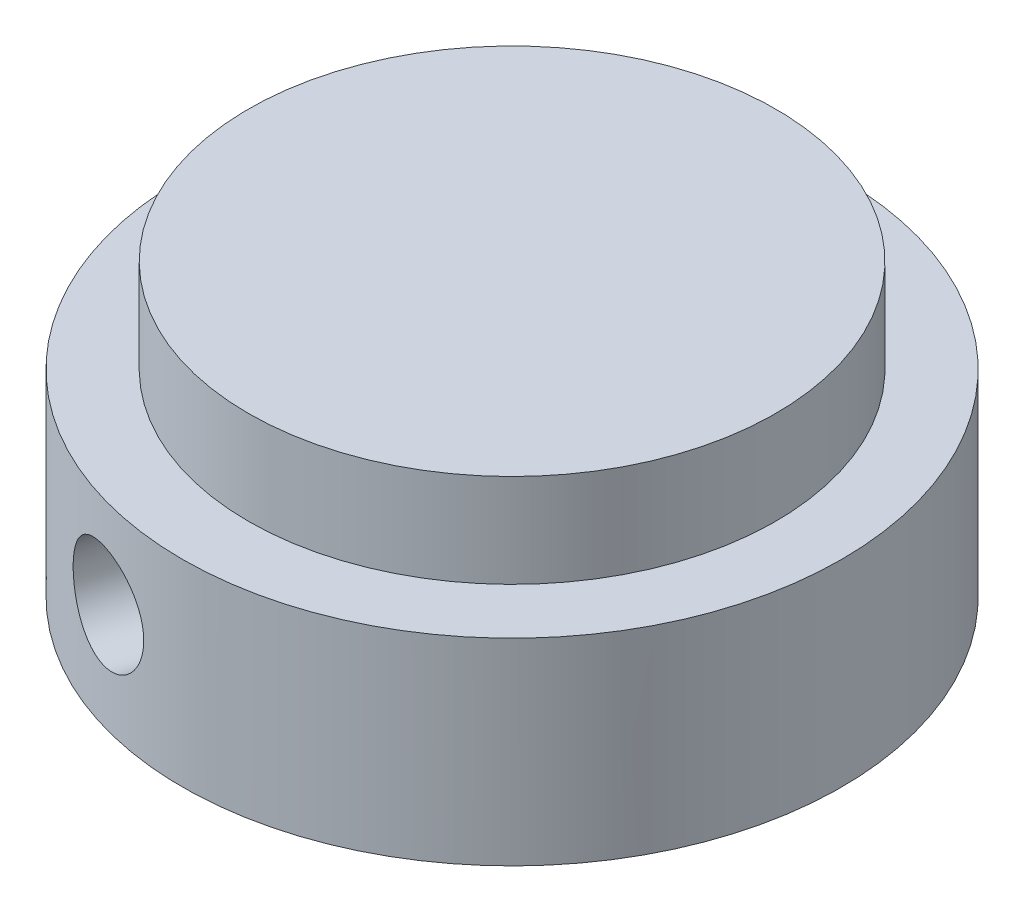
ISO-10303-21;
HEADER;
FILE_DESCRIPTION(('STEP AP214'),'2;1');
FILE_NAME('part.step','',(''),(''),'','','');
FILE_SCHEMA(('AUTOMOTIVE_DESIGN { 1 0 10303 214 1 1 1 1 }'));
ENDSEC;
DATA;
#1=APPLICATION_CONTEXT('core data for automotive mechanical design processes');
#2=APPLICATION_PROTOCOL_DEFINITION('international standard','automotive_design',2000,#1);
#3=PRODUCT_CONTEXT('',#1,'mechanical');
#4=PRODUCT('Part','Part','',(#3));
#5=PRODUCT_RELATED_PRODUCT_CATEGORY('part','',(#4));
#6=PRODUCT_DEFINITION_FORMATION('','',#4);
#7=PRODUCT_DEFINITION_CONTEXT('part definition',#1,'design');
#8=PRODUCT_DEFINITION('design','',#6,#7);
#9=PRODUCT_DEFINITION_SHAPE('','',#8);
#10=(LENGTH_UNIT() NAMED_UNIT(*) SI_UNIT(.MILLI.,.METRE.));
#11=(NAMED_UNIT(*) PLANE_ANGLE_UNIT() SI_UNIT($,.RADIAN.));
#12=(NAMED_UNIT(*) SI_UNIT($,.STERADIAN.) SOLID_ANGLE_UNIT());
#13=UNCERTAINTY_MEASURE_WITH_UNIT(LENGTH_MEASURE(1.E-05),#10,'distance_accuracy_value','');
#14=(GEOMETRIC_REPRESENTATION_CONTEXT(3) GLOBAL_UNCERTAINTY_ASSIGNED_CONTEXT((#13)) GLOBAL_UNIT_ASSIGNED_CONTEXT((#10,
#11,#12)) REPRESENTATION_CONTEXT('',''));
#15=CARTESIAN_POINT('',(0.,0.,0.));
#16=DIRECTION('',(0.,0.,1.));
#17=DIRECTION('',(1.,0.,0.));
#18=AXIS2_PLACEMENT_3D('',#15,#16,#17);
#19=CARTESIAN_POINT('',(0.,6.95,0.));
#20=DIRECTION('',(0.,-1.,0.));
#21=DIRECTION('',(0.,0.,-1.));
#22=AXIS2_PLACEMENT_3D('',#19,#20,#21);
#23=CYLINDRICAL_SURFACE('',#22,6.35);
#24=CARTESIAN_POINT('',(-0.797292792834148,3.37,6.29974794753685));
#25=CARTESIAN_POINT('',(-0.79729525130488,3.31420450438837,6.29974823801068));
#26=CARTESIAN_POINT('',(-0.802001509296117,3.25837745599087,6.2991575334454));
#27=CARTESIAN_POINT('',(-0.820678243632144,3.14828663949508,6.29675094686046));
#28=CARTESIAN_POINT('',(-0.834657541215296,3.09402441131248,6.29493389821797));
#29=CARTESIAN_POINT('',(-0.871397789005002,2.98867258421937,6.289952879728));
#30=CARTESIAN_POINT('',(-0.894151738474111,2.93758049368689,6.28678998343937));
#31=CARTESIAN_POINT('',(-0.94769990574627,2.83994161566388,6.27894049759338));
#32=CARTESIAN_POINT('',(-0.978493105075487,2.79339425343791,6.27425410102629));
#33=CARTESIAN_POINT('',(-1.04743827145764,2.70574945816709,6.26311412672835));
#34=CARTESIAN_POINT('',(-1.08564634109317,2.66469788570581,6.2566469078148));
#35=CARTESIAN_POINT('',(-1.1681042412463,2.58960779456926,6.24177732543147));
#36=CARTESIAN_POINT('',(-1.21235441483791,2.55556967439726,6.23337485205826));
#37=CARTESIAN_POINT('',(-1.30582926707437,2.49530219088853,6.21446636521439));
#38=CARTESIAN_POINT('',(-1.35507911752198,2.46911526061377,6.20394941668809));
#39=CARTESIAN_POINT('',(-1.45688183806511,2.42556600418737,6.1808346179776));
#40=CARTESIAN_POINT('',(-1.5094345159392,2.40820316501539,6.16823688882353));
#41=CARTESIAN_POINT('',(-1.61582966155066,2.38293453744491,6.14121980312012));
#42=CARTESIAN_POINT('',(-1.66965789331231,2.3749518321652,6.12681634968619));
#43=CARTESIAN_POINT('',(-1.77743621821549,2.36843108845774,6.09642144503953));
#44=CARTESIAN_POINT('',(-1.83138630372333,2.36989247394643,6.08043009074635));
#45=CARTESIAN_POINT('',(-1.93738067701917,2.38215804072035,6.047487935886));
#46=CARTESIAN_POINT('',(-1.98943760194862,2.39287945988373,6.03054687411638));
#47=CARTESIAN_POINT('',(-2.09071850503402,2.42323066304918,5.99618693615503));
#48=CARTESIAN_POINT('',(-2.13994240427632,2.44286069506462,5.97876804667338));
#49=CARTESIAN_POINT('',(-2.23446130041196,2.49055554263393,5.94409202523984));
#50=CARTESIAN_POINT('',(-2.27973922214521,2.51865487654433,5.92683585910646));
#51=CARTESIAN_POINT('',(-2.36499659731931,2.58246545181114,5.89333457828057));
#52=CARTESIAN_POINT('',(-2.40497566662503,2.61817724453638,5.8770895369338));
#53=CARTESIAN_POINT('',(-2.47905565902906,2.69665918677317,5.84623073803233));
#54=CARTESIAN_POINT('',(-2.51308818987745,2.73950162959805,5.83163656523745));
#55=CARTESIAN_POINT('',(-2.57389358960827,2.83078400569043,5.80505610826492));
#56=CARTESIAN_POINT('',(-2.60066640467144,2.87922398045095,5.7930698434209));
#57=CARTESIAN_POINT('',(-2.6462986130997,2.98040417690258,5.7723682420415));
#58=CARTESIAN_POINT('',(-2.6651507021103,3.03314831453311,5.76365592546198));
#59=CARTESIAN_POINT('',(-2.69441216963575,3.14139693903576,5.75003530844613));
#60=CARTESIAN_POINT('',(-2.70482220740053,3.19690121000642,5.74512671097415));
#61=CARTESIAN_POINT('',(-2.71685737479049,3.30846003700603,5.7394451355982));
#62=CARTESIAN_POINT('',(-2.71857509226902,3.36450239468247,5.73862857155777));
#63=CARTESIAN_POINT('',(-2.7134301878769,3.476101095312,5.74106300288015));
#64=CARTESIAN_POINT('',(-2.70656786051836,3.53165745488118,5.7443138586278));
#65=CARTESIAN_POINT('',(-2.68450776918268,3.64039047392989,5.75465581619226));
#66=CARTESIAN_POINT('',(-2.66935668849955,3.69357867350046,5.76172540762191));
#67=CARTESIAN_POINT('',(-2.63113835178022,3.79643050316802,5.7792776827341));
#68=CARTESIAN_POINT('',(-2.60807066837302,3.84609394280915,5.78976055067788));
#69=CARTESIAN_POINT('',(-2.55436800948746,3.94093824115516,5.81365389949702));
#70=CARTESIAN_POINT('',(-2.52367202079937,3.9860786253726,5.82708787836903));
#71=CARTESIAN_POINT('',(-2.45556458915228,4.07017833717429,5.85611385674418));
#72=CARTESIAN_POINT('',(-2.41815272626276,4.10913727795779,5.87170599117862));
#73=CARTESIAN_POINT('',(-2.33715512682052,4.18013391422349,5.90441592204452));
#74=CARTESIAN_POINT('',(-2.29351560791987,4.21210442887826,5.92154646854739));
#75=CARTESIAN_POINT('',(-2.2014407867238,4.26774753916752,5.95638967421081));
#76=CARTESIAN_POINT('',(-2.15300562639281,4.29142038034226,5.97410231612933));
#77=CARTESIAN_POINT('',(-2.05282700798789,4.3296900340206,6.00925997984243));
#78=CARTESIAN_POINT('',(-2.00109760662458,4.34432288860669,6.02670579036628));
#79=CARTESIAN_POINT('',(-1.89558919352757,4.36421359321812,6.06071874846832));
#80=CARTESIAN_POINT('',(-1.84181033192342,4.3694721285994,6.07728596019488));
#81=CARTESIAN_POINT('',(-1.73433369656184,4.3704468889769,6.10882064707864));
#82=CARTESIAN_POINT('',(-1.6806413307016,4.36626565245603,6.12380347948735));
#83=CARTESIAN_POINT('',(-1.57430883783511,4.34870021763804,6.15199789559463));
#84=CARTESIAN_POINT('',(-1.52166870641353,4.33531605796611,6.16520948672692));
#85=CARTESIAN_POINT('',(-1.41901500584724,4.29976239653466,6.1896429730235));
#86=CARTESIAN_POINT('',(-1.36899914624067,4.27760070526494,6.20086662429671));
#87=CARTESIAN_POINT('',(-1.27298908616617,4.2251322028154,6.22128690000039));
#88=CARTESIAN_POINT('',(-1.22699504291371,4.19482507341348,6.2304834452113));
#89=CARTESIAN_POINT('',(-1.13991577973397,4.12655837007885,6.24700562218807));
#90=CARTESIAN_POINT('',(-1.09888586925639,4.08852334843233,6.25431105395424));
#91=CARTESIAN_POINT('',(-1.02351373988249,4.00603920533682,6.26708742629195));
#92=CARTESIAN_POINT('',(-0.989173090664211,3.96158858267586,6.27255793650428));
#93=CARTESIAN_POINT('',(-0.928062353099898,3.86720720430433,6.28189180562627));
#94=CARTESIAN_POINT('',(-0.901340858419484,3.81724397337501,6.28574491950529));
#95=CARTESIAN_POINT('',(-0.856651782592933,3.71349924358329,6.29199183597124));
#96=CARTESIAN_POINT('',(-0.838675264564756,3.65972170742047,6.29438712900184));
#97=CARTESIAN_POINT('',(-0.816058292603156,3.5664302547941,6.29735128785535));
#98=CARTESIAN_POINT('',(-0.809033420492525,3.52748777994612,6.29825273234238));
#99=CARTESIAN_POINT('',(-0.79964983504915,3.44903547576493,6.29945095473112));
#100=CARTESIAN_POINT('',(-0.797291051247933,3.40952565500901,6.29974774176453));
#101=CARTESIAN_POINT('',(-0.797292792834148,3.37,6.29974794753685));
#102=B_SPLINE_CURVE_WITH_KNOTS('',3,(#24,#25,#26,#27,#28,#29,#30,#31,#32,#33,#34,#35,#36,#37,
#38,#39,#40,#41,#42,#43,#44,#45,#46,#47,#48,#49,#50,#51,#52,#53,#54,#55,#56,#57,#58,#59,#60,#61,
#62,#63,#64,#65,#66,#67,#68,#69,#70,#71,#72,#73,#74,#75,#76,#77,#78,#79,#80,#81,#82,#83,#84,#85,
#86,#87,#88,#89,#90,#91,#92,#93,#94,#95,#96,#97,#98,#99,#100,#101),.UNSPECIFIED.,.T.,.F.,(4,2,2,
2,2,2,2,2,2,2,2,2,2,2,2,2,2,2,2,2,2,2,2,2,2,2,2,2,2,2,2,2,2,2,2,2,2,2,4),(0.,0.167241987273351,
0.334643296756253,0.501911322767963,0.669158168257542,0.837723589940264,1.00629858684427,
1.17576889898167,1.34522935722426,1.5132903258653,1.68134104299022,1.84790515846086,
2.0144739113157,2.18173094604638,2.34900009928863,2.5180818395907,2.68716483333073,
2.85640341200659,3.02562877336565,3.19304774803899,3.36046097617384,3.52694087656834,
3.69342976565127,3.8612957349455,4.02917220422992,4.19859770549192,4.36801819278297,
4.53675877257189,4.70548701524048,4.8723912948759,5.03929487400903,5.20605027019847,
5.37281218205558,5.54128801238971,5.70980332915819,5.87937052327199,6.04876406315099,
6.16724045363732,6.28571505484885),.UNSPECIFIED.);
#103=CARTESIAN_POINT('',(-0.797292792834148,3.37,6.29974794753685));
#104=VERTEX_POINT('',#103);
#105=EDGE_CURVE('E12',#104,#104,#102,.T.);
#106=ORIENTED_EDGE('',*,*,#105,.T.);
#107=EDGE_LOOP('',(#106));
#108=FACE_BOUND('',#107,.T.);
#109=CARTESIAN_POINT('',(0.,1.35,0.));
#110=DIRECTION('',(0.,-1.,0.));
#111=DIRECTION('',(0.,0.,-1.));
#112=AXIS2_PLACEMENT_3D('',#109,#110,#111);
#113=CIRCLE('',#112,6.35);
#114=CARTESIAN_POINT('',(0.,1.35,-6.35));
#115=VERTEX_POINT('',#114);
#116=EDGE_CURVE('E63',#115,#115,#113,.T.);
#117=ORIENTED_EDGE('',*,*,#116,.F.);
#118=EDGE_LOOP('',(#117));
#119=FACE_BOUND('',#118,.T.);
#120=CARTESIAN_POINT('',(0.,5.15,0.));
#121=DIRECTION('',(0.,1.,0.));
#122=DIRECTION('',(0.,0.,1.));
#123=AXIS2_PLACEMENT_3D('',#120,#121,#122);
#124=CIRCLE('',#123,6.35);
#125=CARTESIAN_POINT('',(0.,5.15,6.35));
#126=VERTEX_POINT('',#125);
#127=EDGE_CURVE('E85',#126,#126,#124,.T.);
#128=ORIENTED_EDGE('',*,*,#127,.F.);
#129=EDGE_LOOP('',(#128));
#130=FACE_BOUND('',#129,.T.);
#131=ADVANCED_FACE('F51',(#108,#119,#130),#23,.T.);
#132=CARTESIAN_POINT('',(0.,1.35,0.));
#133=DIRECTION('',(0.,-1.,0.));
#134=DIRECTION('',(0.,0.,-1.));
#135=AXIS2_PLACEMENT_3D('',#132,#133,#134);
#136=PLANE('',#135);
#137=CARTESIAN_POINT('',(0.,1.35,0.));
#138=DIRECTION('',(0.,-1.,0.));
#139=DIRECTION('',(0.,0.,-1.));
#140=AXIS2_PLACEMENT_3D('',#137,#138,#139);
#141=CIRCLE('',#140,4.);
#142=CARTESIAN_POINT('',(0.,1.35,-4.));
#143=VERTEX_POINT('',#142);
#144=EDGE_CURVE('E87',#143,#143,#141,.T.);
#145=ORIENTED_EDGE('',*,*,#144,.F.);
#146=EDGE_LOOP('',(#145));
#147=FACE_BOUND('',#146,.T.);
#148=ORIENTED_EDGE('',*,*,#116,.T.);
#149=EDGE_LOOP('',(#148));
#150=FACE_BOUND('',#149,.T.);
#151=ADVANCED_FACE('F104',(#147,#150),#136,.T.);
#152=CARTESIAN_POINT('',(0.,1.35,0.));
#153=DIRECTION('',(0.,-1.,0.));
#154=DIRECTION('',(0.,0.,-1.));
#155=AXIS2_PLACEMENT_3D('',#152,#153,#154);
#156=CYLINDRICAL_SURFACE('',#155,4.);
#157=CARTESIAN_POINT('',(0.,0.,0.));
#158=DIRECTION('',(0.,-1.,0.));
#159=DIRECTION('',(0.,0.,-1.));
#160=AXIS2_PLACEMENT_3D('',#157,#158,#159);
#161=CIRCLE('',#160,4.);
#162=CARTESIAN_POINT('',(0.,0.,-4.));
#163=VERTEX_POINT('',#162);
#164=EDGE_CURVE('E91',#163,#163,#161,.T.);
#165=CARTESIAN_POINT('',(0.,1.35,-4.));
#166=CARTESIAN_POINT('',(0.,1.3359375,-4.));
#167=CARTESIAN_POINT('',(0.,1.321875,-4.));
#168=CARTESIAN_POINT('',(0.,1.29375,-4.));
#169=CARTESIAN_POINT('',(0.,1.2796875,-4.));
#170=CARTESIAN_POINT('',(0.,1.2515625,-4.));
#171=CARTESIAN_POINT('',(0.,1.2375,-4.));
#172=CARTESIAN_POINT('',(0.,1.209375,-4.));
#173=CARTESIAN_POINT('',(0.,1.1953125,-4.));
#174=CARTESIAN_POINT('',(0.,1.1671875,-4.));
#175=CARTESIAN_POINT('',(0.,1.153125,-4.));
#176=CARTESIAN_POINT('',(0.,1.125,-4.));
#177=CARTESIAN_POINT('',(0.,1.1109375,-4.));
#178=CARTESIAN_POINT('',(0.,1.0828125,-4.));
#179=CARTESIAN_POINT('',(0.,1.06875,-4.));
#180=CARTESIAN_POINT('',(0.,1.040625,-4.));
#181=CARTESIAN_POINT('',(0.,1.0265625,-4.));
#182=CARTESIAN_POINT('',(0.,0.9984375,-4.));
#183=CARTESIAN_POINT('',(0.,0.984375,-4.));
#184=CARTESIAN_POINT('',(0.,0.95625,-4.));
#185=CARTESIAN_POINT('',(0.,0.9421875,-4.));
#186=CARTESIAN_POINT('',(0.,0.9140625,-4.));
#187=CARTESIAN_POINT('',(0.,0.9,-4.));
#188=CARTESIAN_POINT('',(0.,0.871875,-4.));
#189=CARTESIAN_POINT('',(0.,0.8578125,-4.));
#190=CARTESIAN_POINT('',(0.,0.8296875,-4.));
#191=CARTESIAN_POINT('',(0.,0.815625,-4.));
#192=CARTESIAN_POINT('',(0.,0.7875,-4.));
#193=CARTESIAN_POINT('',(0.,0.7734375,-4.));
#194=CARTESIAN_POINT('',(0.,0.7453125,-4.));
#195=CARTESIAN_POINT('',(0.,0.73125,-4.));
#196=CARTESIAN_POINT('',(0.,0.703125,-4.));
#197=CARTESIAN_POINT('',(0.,0.6890625,-4.));
#198=CARTESIAN_POINT('',(0.,0.6609375,-4.));
#199=CARTESIAN_POINT('',(0.,0.646875,-4.));
#200=CARTESIAN_POINT('',(0.,0.61875,-4.));
#201=CARTESIAN_POINT('',(0.,0.6046875,-4.));
#202=CARTESIAN_POINT('',(0.,0.5765625,-4.));
#203=CARTESIAN_POINT('',(0.,0.5625,-4.));
#204=CARTESIAN_POINT('',(0.,0.534375,-4.));
#205=CARTESIAN_POINT('',(0.,0.5203125,-4.));
#206=CARTESIAN_POINT('',(0.,0.4921875,-4.));
#207=CARTESIAN_POINT('',(0.,0.478125,-4.));
#208=CARTESIAN_POINT('',(0.,0.45,-4.));
#209=CARTESIAN_POINT('',(0.,0.4359375,-4.));
#210=CARTESIAN_POINT('',(0.,0.4078125,-4.));
#211=CARTESIAN_POINT('',(0.,0.39375,-4.));
#212=CARTESIAN_POINT('',(0.,0.365625,-4.));
#213=CARTESIAN_POINT('',(0.,0.3515625,-4.));
#214=CARTESIAN_POINT('',(0.,0.3234375,-4.));
#215=CARTESIAN_POINT('',(0.,0.309375,-4.));
#216=CARTESIAN_POINT('',(0.,0.28125,-4.));
#217=CARTESIAN_POINT('',(0.,0.2671875,-4.));
#218=CARTESIAN_POINT('',(0.,0.2390625,-4.));
#219=CARTESIAN_POINT('',(0.,0.225,-4.));
#220=CARTESIAN_POINT('',(0.,0.196875,-4.));
#221=CARTESIAN_POINT('',(0.,0.1828125,-4.));
#222=CARTESIAN_POINT('',(0.,0.1546875,-4.));
#223=CARTESIAN_POINT('',(0.,0.140625,-4.));
#224=CARTESIAN_POINT('',(0.,0.1125,-4.));
#225=CARTESIAN_POINT('',(0.,0.0984375000000002,-4.));
#226=CARTESIAN_POINT('',(0.,0.0703125000000002,-4.));
#227=CARTESIAN_POINT('',(0.,0.0562500000000002,-4.));
#228=CARTESIAN_POINT('',(0.,0.0281250000000002,-4.));
#229=CARTESIAN_POINT('',(0.,0.0140625000000002,-4.));
#230=CARTESIAN_POINT('',(0.,0.,-4.));
#231=B_SPLINE_CURVE_WITH_KNOTS('',3,(#165,#166,#167,#168,#169,#170,#171,#172,#173,#174,#175,
#176,#177,#178,#179,#180,#181,#182,#183,#184,#185,#186,#187,#188,#189,#190,#191,#192,#193,#194,
#195,#196,#197,#198,#199,#200,#201,#202,#203,#204,#205,#206,#207,#208,#209,#210,#211,#212,#213,
#214,#215,#216,#217,#218,#219,#220,#221,#222,#223,#224,#225,#226,#227,#228,#229,#230),
.UNSPECIFIED.,.F.,.F.,(4,2,2,2,2,2,2,2,2,2,2,2,2,2,2,2,2,2,2,2,2,2,2,2,2,2,2,2,2,2,2,2,4),(0.,
0.0421874999999999,0.0843749999999998,0.1265625,0.16875,0.2109375,0.253125,0.2953125,0.3375,
0.3796875,0.421875,0.4640625,0.50625,0.5484375,0.590625,0.6328125,0.675,0.7171875,0.759375,
0.8015625,0.84375,0.8859375,0.928125,0.9703125,1.0125,1.0546875,1.096875,1.1390625,1.18125,
1.2234375,1.265625,1.3078125,1.35),.UNSPECIFIED.);
#232=EDGE_CURVE('BSEAM109',#143,#163,#231,.T.);
#233=ORIENTED_EDGE('',*,*,#144,.T.);
#234=ORIENTED_EDGE('',*,*,#164,.F.);
#235=ORIENTED_EDGE('',*,*,#232,.T.);
#236=ORIENTED_EDGE('',*,*,#232,.F.);
#237=EDGE_LOOP('',(#233,#235,#234,#236));
#238=FACE_BOUND('',#237,.T.);
#239=ADVANCED_FACE('F109',(#238),#156,.T.);
#240=CARTESIAN_POINT('',(0.,0.,0.));
#241=DIRECTION('',(0.,1.,0.));
#242=DIRECTION('',(0.,0.,1.));
#243=AXIS2_PLACEMENT_3D('',#240,#241,#242);
#244=PLANE('',#243);
#245=ORIENTED_EDGE('',*,*,#164,.T.);
#246=EDGE_LOOP('',(#245));
#247=FACE_BOUND('',#246,.T.);
#248=ADVANCED_FACE('F132',(#247),#244,.F.);
#249=CARTESIAN_POINT('',(0.,5.15,0.));
#250=DIRECTION('',(0.,1.,0.));
#251=DIRECTION('',(0.,0.,1.));
#252=AXIS2_PLACEMENT_3D('',#249,#250,#251);
#253=PLANE('',#252);
#254=CARTESIAN_POINT('',(0.,5.15,0.));
#255=DIRECTION('',(0.,1.,0.));
#256=DIRECTION('',(0.,0.,1.));
#257=AXIS2_PLACEMENT_3D('',#254,#255,#256);
#258=CIRCLE('',#257,5.08);
#259=CARTESIAN_POINT('',(0.,5.15,5.08));
#260=VERTEX_POINT('',#259);
#261=EDGE_CURVE('E80',#260,#260,#258,.T.);
#262=ORIENTED_EDGE('',*,*,#261,.F.);
#263=EDGE_LOOP('',(#262));
#264=FACE_BOUND('',#263,.T.);
#265=ORIENTED_EDGE('',*,*,#127,.T.);
#266=EDGE_LOOP('',(#265));
#267=FACE_BOUND('',#266,.T.);
#268=ADVANCED_FACE('F101',(#264,#267),#253,.T.);
#269=CARTESIAN_POINT('',(0.,5.15,0.));
#270=DIRECTION('',(0.,1.,0.));
#271=DIRECTION('',(0.,0.,1.));
#272=AXIS2_PLACEMENT_3D('',#269,#270,#271);
#273=CYLINDRICAL_SURFACE('',#272,5.08);
#274=ORIENTED_EDGE('',*,*,#261,.T.);
#275=EDGE_LOOP('',(#274));
#276=FACE_BOUND('',#275,.T.);
#277=CARTESIAN_POINT('',(0.,6.95,0.));
#278=DIRECTION('',(0.,1.,0.));
#279=DIRECTION('',(0.,0.,1.));
#280=AXIS2_PLACEMENT_3D('',#277,#278,#279);
#281=CIRCLE('',#280,5.08);
#282=CARTESIAN_POINT('',(0.,6.95,5.08));
#283=VERTEX_POINT('',#282);
#284=EDGE_CURVE('E76',#283,#283,#281,.T.);
#285=ORIENTED_EDGE('',*,*,#284,.F.);
#286=EDGE_LOOP('',(#285));
#287=FACE_BOUND('',#286,.T.);
#288=ADVANCED_FACE('F122',(#276,#287),#273,.T.);
#289=CARTESIAN_POINT('',(0.,6.95,0.));
#290=DIRECTION('',(0.,1.,0.));
#291=DIRECTION('',(0.,0.,1.));
#292=AXIS2_PLACEMENT_3D('',#289,#290,#291);
#293=PLANE('',#292);
#294=ORIENTED_EDGE('',*,*,#284,.T.);
#295=EDGE_LOOP('',(#294));
#296=FACE_BOUND('',#295,.T.);
#297=ADVANCED_FACE('F118',(#296),#293,.T.);
#298=CARTESIAN_POINT('',(-1.77943056520278,3.37,6.09558256966651));
#299=DIRECTION('',(-0.280225285858705,0.,0.959934262939607));
#300=DIRECTION('',(0.959934262939607,0.,0.280225285858705));
#301=AXIS2_PLACEMENT_3D('',#298,#299,#300);
#302=CYLINDRICAL_SURFACE('',#301,0.999999999999994);
#303=CARTESIAN_POINT('',(-1.21897999348537,3.37,4.17571404378729));
#304=DIRECTION('',(-0.280225285858705,0.,0.959934262939607));
#305=DIRECTION('',(0.959934262939607,0.,0.280225285858705));
#306=AXIS2_PLACEMENT_3D('',#303,#304,#305);
#307=CIRCLE('',#306,1.);
#308=CARTESIAN_POINT('',(-0.25904573054576,3.37,4.455939329646));
#309=VERTEX_POINT('',#308);
#310=EDGE_CURVE('E73',#309,#309,#307,.T.);
#311=ORIENTED_EDGE('',*,*,#310,.F.);
#312=EDGE_LOOP('',(#311));
#313=FACE_BOUND('',#312,.T.);
#314=ORIENTED_EDGE('',*,*,#105,.F.);
#315=EDGE_LOOP('',(#314));
#316=FACE_BOUND('',#315,.T.);
#317=ADVANCED_FACE('F69',(#313,#316),#302,.F.);
#318=CARTESIAN_POINT('',(-1.21897999348537,3.37,4.17571404378729));
#319=DIRECTION('',(-0.280225285858705,0.,0.959934262939607));
#320=DIRECTION('',(0.959934262939607,0.,0.280225285858705));
#321=AXIS2_PLACEMENT_3D('',#318,#319,#320);
#322=CONICAL_SURFACE('',#321,1.,1.02974425867665);
#323=CARTESIAN_POINT('',(-1.05060365475713,3.37,3.59892734833163));
#324=VERTEX_POINT('',#323);
#325=VERTEX_LOOP('',#324);
#326=FACE_BOUND('',#325,.T.);
#327=ORIENTED_EDGE('',*,*,#310,.T.);
#328=EDGE_LOOP('',(#327));
#329=FACE_BOUND('',#328,.T.);
#330=ADVANCED_FACE('F66',(#326,#329),#322,.F.);
#331=CLOSED_SHELL('',(#131,#151,#239,#248,#268,#288,#297,#317,#330));
#332=MANIFOLD_SOLID_BREP('B2',#331);
#333=ADVANCED_BREP_SHAPE_REPRESENTATION('',(#18,#332),#14);
#334=SHAPE_DEFINITION_REPRESENTATION(#9,#333);
ENDSEC;
END-ISO-10303-21;
